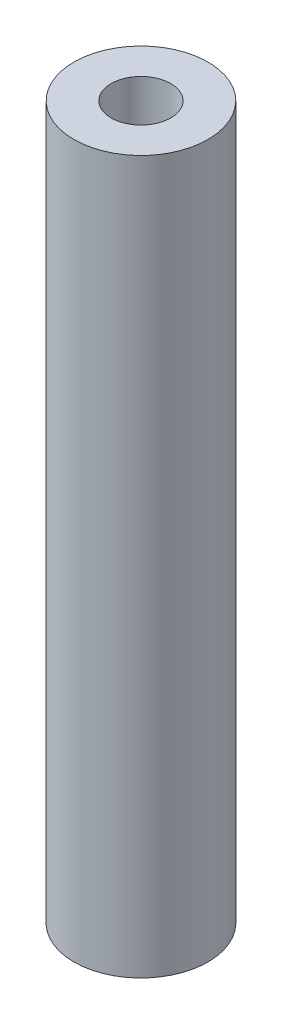
ISO-10303-21;
HEADER;
FILE_DESCRIPTION(('STEP AP214'),'2;1');
FILE_NAME('part.step','',(''),(''),'','','');
FILE_SCHEMA(('AUTOMOTIVE_DESIGN { 1 0 10303 214 1 1 1 1 }'));
ENDSEC;
DATA;
#1=APPLICATION_CONTEXT('core data for automotive mechanical design processes');
#2=APPLICATION_PROTOCOL_DEFINITION('international standard','automotive_design',2000,#1);
#3=PRODUCT_CONTEXT('',#1,'mechanical');
#4=PRODUCT('Part','Part','',(#3));
#5=PRODUCT_RELATED_PRODUCT_CATEGORY('part','',(#4));
#6=PRODUCT_DEFINITION_FORMATION('','',#4);
#7=PRODUCT_DEFINITION_CONTEXT('part definition',#1,'design');
#8=PRODUCT_DEFINITION('design','',#6,#7);
#9=PRODUCT_DEFINITION_SHAPE('','',#8);
#10=(LENGTH_UNIT() NAMED_UNIT(*) SI_UNIT(.MILLI.,.METRE.));
#11=(NAMED_UNIT(*) PLANE_ANGLE_UNIT() SI_UNIT($,.RADIAN.));
#12=(NAMED_UNIT(*) SI_UNIT($,.STERADIAN.) SOLID_ANGLE_UNIT());
#13=UNCERTAINTY_MEASURE_WITH_UNIT(LENGTH_MEASURE(1.E-05),#10,'distance_accuracy_value','');
#14=(GEOMETRIC_REPRESENTATION_CONTEXT(3) GLOBAL_UNCERTAINTY_ASSIGNED_CONTEXT((#13)) GLOBAL_UNIT_ASSIGNED_CONTEXT((#10,
#11,#12)) REPRESENTATION_CONTEXT('',''));
#15=CARTESIAN_POINT('',(0.,0.,0.));
#16=DIRECTION('',(0.,0.,1.));
#17=DIRECTION('',(1.,0.,0.));
#18=AXIS2_PLACEMENT_3D('',#15,#16,#17);
#19=CARTESIAN_POINT('',(0.,28.68,0.));
#20=DIRECTION('',(0.,1.,0.));
#21=DIRECTION('',(0.,0.,1.));
#22=AXIS2_PLACEMENT_3D('',#19,#20,#21);
#23=PLANE('',#22);
#24=CARTESIAN_POINT('',(0.,28.68,0.));
#25=DIRECTION('',(0.,1.,0.));
#26=DIRECTION('',(0.,0.,1.));
#27=AXIS2_PLACEMENT_3D('',#24,#25,#26);
#28=CIRCLE('',#27,2.7);
#29=CARTESIAN_POINT('',(0.,28.68,2.7));
#30=VERTEX_POINT('',#29);
#31=EDGE_CURVE('E10',#30,#30,#28,.T.);
#32=ORIENTED_EDGE('',*,*,#31,.T.);
#33=EDGE_LOOP('',(#32));
#34=FACE_BOUND('',#33,.T.);
#35=CARTESIAN_POINT('',(0.,28.68,0.));
#36=DIRECTION('',(0.,1.,0.));
#37=DIRECTION('',(0.,0.,1.));
#38=AXIS2_PLACEMENT_3D('',#35,#36,#37);
#39=CIRCLE('',#38,1.2);
#40=CARTESIAN_POINT('',(0.,28.68,1.2));
#41=VERTEX_POINT('',#40);
#42=EDGE_CURVE('E50',#41,#41,#39,.T.);
#43=ORIENTED_EDGE('',*,*,#42,.F.);
#44=EDGE_LOOP('',(#43));
#45=FACE_BOUND('',#44,.T.);
#46=ADVANCED_FACE('F37',(#34,#45),#23,.T.);
#47=CARTESIAN_POINT('',(0.,0.,0.));
#48=DIRECTION('',(0.,1.,0.));
#49=DIRECTION('',(0.,0.,1.));
#50=AXIS2_PLACEMENT_3D('',#47,#48,#49);
#51=PLANE('',#50);
#52=CARTESIAN_POINT('',(0.,0.,0.));
#53=DIRECTION('',(0.,1.,0.));
#54=DIRECTION('',(0.,0.,1.));
#55=AXIS2_PLACEMENT_3D('',#52,#53,#54);
#56=CIRCLE('',#55,2.7);
#57=CARTESIAN_POINT('',(0.,0.,2.7));
#58=VERTEX_POINT('',#57);
#59=EDGE_CURVE('E41',#58,#58,#56,.T.);
#60=ORIENTED_EDGE('',*,*,#59,.F.);
#61=EDGE_LOOP('',(#60));
#62=FACE_BOUND('',#61,.T.);
#63=CARTESIAN_POINT('',(0.,0.,0.));
#64=DIRECTION('',(0.,1.,0.));
#65=DIRECTION('',(0.,0.,1.));
#66=AXIS2_PLACEMENT_3D('',#63,#64,#65);
#67=CIRCLE('',#66,1.2);
#68=CARTESIAN_POINT('',(0.,0.,1.2));
#69=VERTEX_POINT('',#68);
#70=EDGE_CURVE('E52',#69,#69,#67,.T.);
#71=ORIENTED_EDGE('',*,*,#70,.T.);
#72=EDGE_LOOP('',(#71));
#73=FACE_BOUND('',#72,.T.);
#74=ADVANCED_FACE('F64',(#62,#73),#51,.F.);
#75=CARTESIAN_POINT('',(0.,28.68,0.));
#76=DIRECTION('',(0.,-1.,0.));
#77=DIRECTION('',(0.,0.,-1.));
#78=AXIS2_PLACEMENT_3D('',#75,#76,#77);
#79=CYLINDRICAL_SURFACE('',#78,2.7);
#80=ORIENTED_EDGE('',*,*,#31,.F.);
#81=EDGE_LOOP('',(#80));
#82=FACE_BOUND('',#81,.T.);
#83=ORIENTED_EDGE('',*,*,#59,.T.);
#84=EDGE_LOOP('',(#83));
#85=FACE_BOUND('',#84,.T.);
#86=ADVANCED_FACE('F39',(#82,#85),#79,.T.);
#87=CARTESIAN_POINT('',(0.,28.68,0.));
#88=DIRECTION('',(0.,-1.,0.));
#89=DIRECTION('',(0.,0.,-1.));
#90=AXIS2_PLACEMENT_3D('',#87,#88,#89);
#91=CYLINDRICAL_SURFACE('',#90,1.2);
#92=ORIENTED_EDGE('',*,*,#42,.T.);
#93=EDGE_LOOP('',(#92));
#94=FACE_BOUND('',#93,.T.);
#95=ORIENTED_EDGE('',*,*,#70,.F.);
#96=EDGE_LOOP('',(#95));
#97=FACE_BOUND('',#96,.T.);
#98=ADVANCED_FACE('F60',(#94,#97),#91,.F.);
#99=CLOSED_SHELL('',(#46,#74,#86,#98));
#100=MANIFOLD_SOLID_BREP('B2',#99);
#101=ADVANCED_BREP_SHAPE_REPRESENTATION('',(#18,#100),#14);
#102=SHAPE_DEFINITION_REPRESENTATION(#9,#101);
ENDSEC;
END-ISO-10303-21;
